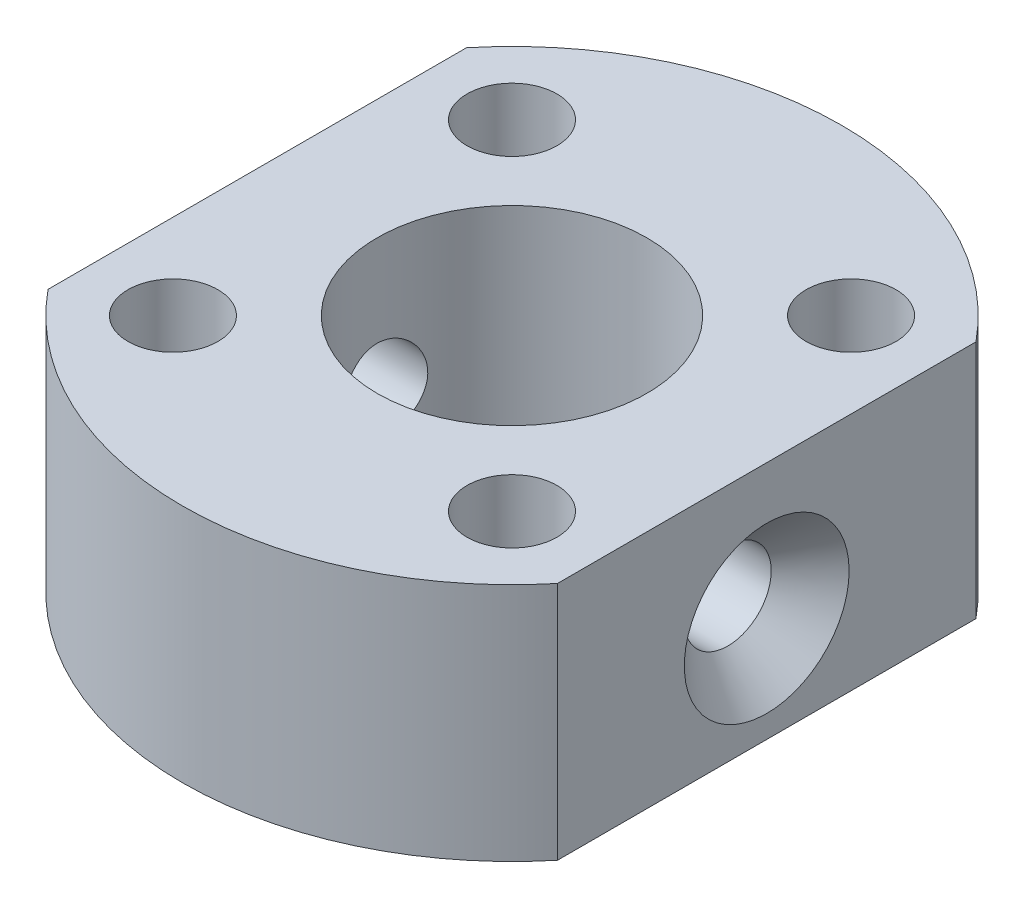
ISO-10303-21;
HEADER;
FILE_DESCRIPTION(('STEP AP214'),'2;1');
FILE_NAME('part.step','',(''),(''),'','','');
FILE_SCHEMA(('AUTOMOTIVE_DESIGN { 1 0 10303 214 1 1 1 1 }'));
ENDSEC;
DATA;
#1=APPLICATION_CONTEXT('core data for automotive mechanical design processes');
#2=APPLICATION_PROTOCOL_DEFINITION('international standard','automotive_design',2000,#1);
#3=PRODUCT_CONTEXT('',#1,'mechanical');
#4=PRODUCT('Part','Part','',(#3));
#5=PRODUCT_RELATED_PRODUCT_CATEGORY('part','',(#4));
#6=PRODUCT_DEFINITION_FORMATION('','',#4);
#7=PRODUCT_DEFINITION_CONTEXT('part definition',#1,'design');
#8=PRODUCT_DEFINITION('design','',#6,#7);
#9=PRODUCT_DEFINITION_SHAPE('','',#8);
#10=(LENGTH_UNIT() NAMED_UNIT(*) SI_UNIT(.MILLI.,.METRE.));
#11=(NAMED_UNIT(*) PLANE_ANGLE_UNIT() SI_UNIT($,.RADIAN.));
#12=(NAMED_UNIT(*) SI_UNIT($,.STERADIAN.) SOLID_ANGLE_UNIT());
#13=UNCERTAINTY_MEASURE_WITH_UNIT(LENGTH_MEASURE(1.E-05),#10,'distance_accuracy_value','');
#14=(GEOMETRIC_REPRESENTATION_CONTEXT(3) GLOBAL_UNCERTAINTY_ASSIGNED_CONTEXT((#13)) GLOBAL_UNIT_ASSIGNED_CONTEXT((#10,
#11,#12)) REPRESENTATION_CONTEXT('',''));
#15=CARTESIAN_POINT('',(0.,0.,0.));
#16=DIRECTION('',(0.,0.,1.));
#17=DIRECTION('',(1.,0.,0.));
#18=AXIS2_PLACEMENT_3D('',#15,#16,#17);
#19=CARTESIAN_POINT('',(0.,8.,0.));
#20=DIRECTION('',(0.,-1.,0.));
#21=DIRECTION('',(0.,0.,-1.));
#22=AXIS2_PLACEMENT_3D('',#19,#20,#21);
#23=CYLINDRICAL_SURFACE('',#22,11.);
#24=DIRECTION('',(0.,-1.,0.));
#25=VECTOR('',#24,1.);
#26=CARTESIAN_POINT('',(8.5,8.,6.98212002188447));
#27=LINE('',#26,#25);
#28=CARTESIAN_POINT('',(8.5,8.,6.98212002188447));
#29=VERTEX_POINT('',#28);
#30=CARTESIAN_POINT('',(8.5,0.,6.98212002188447));
#31=VERTEX_POINT('',#30);
#32=EDGE_CURVE('E62',#29,#31,#27,.T.);
#33=ORIENTED_EDGE('',*,*,#32,.F.);
#34=CARTESIAN_POINT('',(0.,8.,0.));
#35=DIRECTION('',(0.,1.,0.));
#36=DIRECTION('',(0.,0.,1.));
#37=AXIS2_PLACEMENT_3D('',#34,#35,#36);
#38=CIRCLE('',#37,11.);
#39=CARTESIAN_POINT('',(-8.5,8.,6.98212002188447));
#40=VERTEX_POINT('',#39);
#41=EDGE_CURVE('E203',#40,#29,#38,.T.);
#42=ORIENTED_EDGE('',*,*,#41,.F.);
#43=DIRECTION('',(0.,-1.,0.));
#44=VECTOR('',#43,1.);
#45=CARTESIAN_POINT('',(-8.5,8.,6.98212002188447));
#46=LINE('',#45,#44);
#47=CARTESIAN_POINT('',(-8.5,0.,6.98212002188447));
#48=VERTEX_POINT('',#47);
#49=EDGE_CURVE('E192',#48,#40,#46,.F.);
#50=ORIENTED_EDGE('',*,*,#49,.F.);
#51=CARTESIAN_POINT('',(0.,0.,0.));
#52=DIRECTION('',(0.,1.,0.));
#53=DIRECTION('',(0.,0.,1.));
#54=AXIS2_PLACEMENT_3D('',#51,#52,#53);
#55=CIRCLE('',#54,11.);
#56=EDGE_CURVE('E202',#48,#31,#55,.T.);
#57=ORIENTED_EDGE('',*,*,#56,.T.);
#58=EDGE_LOOP('',(#33,#42,#50,#57));
#59=FACE_BOUND('',#58,.T.);
#60=ADVANCED_FACE('F40',(#59),#23,.T.);
#61=DIRECTION('',(0.,-1.,0.));
#62=VECTOR('',#61,1.);
#63=CARTESIAN_POINT('',(8.5,8.,-6.98212002188447));
#64=LINE('',#63,#62);
#65=CARTESIAN_POINT('',(8.5,0.,-6.98212002188447));
#66=VERTEX_POINT('',#65);
#67=CARTESIAN_POINT('',(8.5,8.,-6.98212002188447));
#68=VERTEX_POINT('',#67);
#69=EDGE_CURVE('E197',#66,#68,#64,.F.);
#70=ORIENTED_EDGE('',*,*,#69,.F.);
#71=CARTESIAN_POINT('',(-8.5,0.,-6.98212002188447));
#72=VERTEX_POINT('',#71);
#73=EDGE_CURVE('E208',#66,#72,#55,.T.);
#74=ORIENTED_EDGE('',*,*,#73,.T.);
#75=DIRECTION('',(0.,-1.,0.));
#76=VECTOR('',#75,1.);
#77=CARTESIAN_POINT('',(-8.5,8.,-6.98212002188447));
#78=LINE('',#77,#76);
#79=CARTESIAN_POINT('',(-8.5,8.,-6.98212002188447));
#80=VERTEX_POINT('',#79);
#81=EDGE_CURVE('E55',#80,#72,#78,.T.);
#82=ORIENTED_EDGE('',*,*,#81,.F.);
#83=EDGE_CURVE('E207',#68,#80,#38,.T.);
#84=ORIENTED_EDGE('',*,*,#83,.F.);
#85=EDGE_LOOP('',(#70,#74,#82,#84));
#86=FACE_BOUND('',#85,.T.);
#87=ADVANCED_FACE('F221',(#86),#23,.T.);
#88=CARTESIAN_POINT('',(0.,8.,0.));
#89=DIRECTION('',(0.,1.,0.));
#90=DIRECTION('',(0.,0.,1.));
#91=AXIS2_PLACEMENT_3D('',#88,#89,#90);
#92=PLANE('',#91);
#93=CARTESIAN_POINT('',(5.65685424949235,8.,-5.65685424949241));
#94=DIRECTION('',(0.,1.,0.));
#95=DIRECTION('',(0.,0.,1.));
#96=AXIS2_PLACEMENT_3D('',#93,#94,#95);
#97=CIRCLE('',#96,1.49999999999999);
#98=CARTESIAN_POINT('',(5.65685424949235,8.,-4.15685424949242));
#99=VERTEX_POINT('',#98);
#100=EDGE_CURVE('E102',#99,#99,#97,.T.);
#101=ORIENTED_EDGE('',*,*,#100,.F.);
#102=EDGE_LOOP('',(#101));
#103=FACE_BOUND('',#102,.T.);
#104=CARTESIAN_POINT('',(5.65685424949235,8.,5.65685424949241));
#105=DIRECTION('',(0.,1.,0.));
#106=DIRECTION('',(0.,0.,1.));
#107=AXIS2_PLACEMENT_3D('',#104,#105,#106);
#108=CIRCLE('',#107,1.49999999999999);
#109=CARTESIAN_POINT('',(5.65685424949235,8.,7.1568542494924));
#110=VERTEX_POINT('',#109);
#111=EDGE_CURVE('E101',#110,#110,#108,.T.);
#112=ORIENTED_EDGE('',*,*,#111,.F.);
#113=EDGE_LOOP('',(#112));
#114=FACE_BOUND('',#113,.T.);
#115=CARTESIAN_POINT('',(-5.65685424949239,8.,5.65685424949237));
#116=DIRECTION('',(0.,1.,0.));
#117=DIRECTION('',(0.,0.,1.));
#118=AXIS2_PLACEMENT_3D('',#115,#116,#117);
#119=CIRCLE('',#118,1.49999999999999);
#120=CARTESIAN_POINT('',(-5.65685424949239,8.,7.15685424949236));
#121=VERTEX_POINT('',#120);
#122=EDGE_CURVE('E115',#121,#121,#119,.T.);
#123=ORIENTED_EDGE('',*,*,#122,.F.);
#124=EDGE_LOOP('',(#123));
#125=FACE_BOUND('',#124,.T.);
#126=CARTESIAN_POINT('',(-5.65685424949235,8.,-5.65685424949241));
#127=DIRECTION('',(0.,1.,0.));
#128=DIRECTION('',(0.,0.,1.));
#129=AXIS2_PLACEMENT_3D('',#126,#127,#128);
#130=CIRCLE('',#129,1.49999999999999);
#131=CARTESIAN_POINT('',(-5.65685424949235,8.,-4.15685424949242));
#132=VERTEX_POINT('',#131);
#133=EDGE_CURVE('E123',#132,#132,#130,.T.);
#134=ORIENTED_EDGE('',*,*,#133,.F.);
#135=EDGE_LOOP('',(#134));
#136=FACE_BOUND('',#135,.T.);
#137=CARTESIAN_POINT('',(0.,8.,0.));
#138=DIRECTION('',(0.,1.,0.));
#139=DIRECTION('',(0.,0.,1.));
#140=AXIS2_PLACEMENT_3D('',#137,#138,#139);
#141=CIRCLE('',#140,4.5);
#142=CARTESIAN_POINT('',(0.,8.,4.5));
#143=VERTEX_POINT('',#142);
#144=EDGE_CURVE('E175',#143,#143,#141,.T.);
#145=ORIENTED_EDGE('',*,*,#144,.F.);
#146=EDGE_LOOP('',(#145));
#147=FACE_BOUND('',#146,.T.);
#148=ORIENTED_EDGE('',*,*,#41,.T.);
#149=DIRECTION('',(0.,0.,-1.));
#150=VECTOR('',#149,1.);
#151=CARTESIAN_POINT('',(8.5,8.,-11.5));
#152=LINE('',#151,#150);
#153=EDGE_CURVE('E184',#29,#68,#152,.T.);
#154=ORIENTED_EDGE('',*,*,#153,.T.);
#155=ORIENTED_EDGE('',*,*,#83,.T.);
#156=DIRECTION('',(0.,0.,1.));
#157=VECTOR('',#156,1.);
#158=CARTESIAN_POINT('',(-8.5,8.,-11.5));
#159=LINE('',#158,#157);
#160=EDGE_CURVE('E188',#80,#40,#159,.T.);
#161=ORIENTED_EDGE('',*,*,#160,.T.);
#162=EDGE_LOOP('',(#148,#154,#155,#161));
#163=FACE_BOUND('',#162,.T.);
#164=ADVANCED_FACE('F217',(#103,#114,#125,#136,#147,#163),#92,.T.);
#165=CARTESIAN_POINT('',(0.,0.,0.));
#166=DIRECTION('',(0.,1.,0.));
#167=DIRECTION('',(0.,0.,1.));
#168=AXIS2_PLACEMENT_3D('',#165,#166,#167);
#169=PLANE('',#168);
#170=CARTESIAN_POINT('',(0.,0.,0.));
#171=DIRECTION('',(0.,1.,0.));
#172=DIRECTION('',(0.,0.,1.));
#173=AXIS2_PLACEMENT_3D('',#170,#171,#172);
#174=CIRCLE('',#173,4.5);
#175=CARTESIAN_POINT('',(0.,0.,4.5));
#176=VERTEX_POINT('',#175);
#177=EDGE_CURVE('E180',#176,#176,#174,.T.);
#178=ORIENTED_EDGE('',*,*,#177,.T.);
#179=EDGE_LOOP('',(#178));
#180=FACE_BOUND('',#179,.T.);
#181=DIRECTION('',(0.,0.,-1.));
#182=VECTOR('',#181,1.);
#183=CARTESIAN_POINT('',(8.5,0.,0.));
#184=LINE('',#183,#182);
#185=EDGE_CURVE('E12',#31,#66,#184,.T.);
#186=ORIENTED_EDGE('',*,*,#185,.F.);
#187=ORIENTED_EDGE('',*,*,#56,.F.);
#188=DIRECTION('',(0.,0.,1.));
#189=VECTOR('',#188,1.);
#190=CARTESIAN_POINT('',(-8.5,0.,0.));
#191=LINE('',#190,#189);
#192=EDGE_CURVE('E48',#72,#48,#191,.T.);
#193=ORIENTED_EDGE('',*,*,#192,.F.);
#194=ORIENTED_EDGE('',*,*,#73,.F.);
#195=EDGE_LOOP('',(#186,#187,#193,#194));
#196=FACE_BOUND('',#195,.T.);
#197=ADVANCED_FACE('F236',(#180,#196),#169,.F.);
#198=CARTESIAN_POINT('',(-8.5,0.,-11.5));
#199=DIRECTION('',(-1.,0.,0.));
#200=DIRECTION('',(0.,0.,1.));
#201=AXIS2_PLACEMENT_3D('',#198,#199,#200);
#202=PLANE('',#201);
#203=CARTESIAN_POINT('',(-8.5,3.5,0.));
#204=DIRECTION('',(-1.,0.,0.));
#205=DIRECTION('',(0.,0.,1.));
#206=AXIS2_PLACEMENT_3D('',#203,#204,#205);
#207=CIRCLE('',#206,2.75);
#208=CARTESIAN_POINT('',(-8.5,3.5,2.75));
#209=VERTEX_POINT('',#208);
#210=EDGE_CURVE('E148',#209,#209,#207,.T.);
#211=ORIENTED_EDGE('',*,*,#210,.F.);
#212=EDGE_LOOP('',(#211));
#213=FACE_BOUND('',#212,.T.);
#214=ORIENTED_EDGE('',*,*,#81,.T.);
#215=ORIENTED_EDGE('',*,*,#192,.T.);
#216=ORIENTED_EDGE('',*,*,#49,.T.);
#217=ORIENTED_EDGE('',*,*,#160,.F.);
#218=EDGE_LOOP('',(#214,#215,#216,#217));
#219=FACE_BOUND('',#218,.T.);
#220=ADVANCED_FACE('F233',(#213,#219),#202,.T.);
#221=CARTESIAN_POINT('',(8.5,0.,-11.5));
#222=DIRECTION('',(1.,0.,0.));
#223=DIRECTION('',(0.,0.,-1.));
#224=AXIS2_PLACEMENT_3D('',#221,#222,#223);
#225=PLANE('',#224);
#226=CARTESIAN_POINT('',(8.5,3.5,0.));
#227=DIRECTION('',(1.,0.,0.));
#228=DIRECTION('',(0.,0.,-1.));
#229=AXIS2_PLACEMENT_3D('',#226,#227,#228);
#230=CIRCLE('',#229,2.75);
#231=CARTESIAN_POINT('',(8.5,3.5,-2.75));
#232=VERTEX_POINT('',#231);
#233=EDGE_CURVE('E131',#232,#232,#230,.T.);
#234=ORIENTED_EDGE('',*,*,#233,.F.);
#235=EDGE_LOOP('',(#234));
#236=FACE_BOUND('',#235,.T.);
#237=ORIENTED_EDGE('',*,*,#32,.T.);
#238=ORIENTED_EDGE('',*,*,#185,.T.);
#239=ORIENTED_EDGE('',*,*,#69,.T.);
#240=ORIENTED_EDGE('',*,*,#153,.F.);
#241=EDGE_LOOP('',(#237,#238,#239,#240));
#242=FACE_BOUND('',#241,.T.);
#243=ADVANCED_FACE('F235',(#236,#242),#225,.T.);
#244=CARTESIAN_POINT('',(0.,8.,0.));
#245=DIRECTION('',(0.,1.,0.));
#246=DIRECTION('',(0.,0.,1.));
#247=AXIS2_PLACEMENT_3D('',#244,#245,#246);
#248=CYLINDRICAL_SURFACE('',#247,4.5);
#249=CARTESIAN_POINT('',(4.25998826289463,3.5,-1.45));
#250=CARTESIAN_POINT('',(4.25998843480729,3.42085654612259,-1.44999986275386));
#251=CARTESIAN_POINT('',(4.26221791336186,3.34171116376903,-1.44349836416739));
#252=CARTESIAN_POINT('',(4.27085237816489,3.18575460102328,-1.41774461709383));
#253=CARTESIAN_POINT('',(4.27725828599524,3.10894393973302,-1.39848955435671));
#254=CARTESIAN_POINT('',(4.29344634449653,2.95993960714215,-1.34796673756285));
#255=CARTESIAN_POINT('',(4.30322222469381,2.88773765410843,-1.31672128177157));
#256=CARTESIAN_POINT('',(4.32503983493147,2.74957890070288,-1.24317985490116));
#257=CARTESIAN_POINT('',(4.33708201208201,2.68362333652662,-1.20088170263162));
#258=CARTESIAN_POINT('',(4.36256885719382,2.55741968017783,-1.10478023899614));
#259=CARTESIAN_POINT('',(4.37604678447458,2.4974332735683,-1.0506420115697));
#260=CARTESIAN_POINT('',(4.40260437431034,2.38721423351113,-0.933112971044264));
#261=CARTESIAN_POINT('',(4.41568397727571,2.33698305346767,-0.869720781683794));
#262=CARTESIAN_POINT('',(4.44035377565032,2.24653065494341,-0.733587572821637));
#263=CARTESIAN_POINT('',(4.45190026881809,2.20658108694841,-0.660657440656988));
#264=CARTESIAN_POINT('',(4.47181288201274,2.1396185449379,-0.508677245618695));
#265=CARTESIAN_POINT('',(4.48017979952395,2.11260232660595,-0.42962872332232));
#266=CARTESIAN_POINT('',(4.49255504595337,2.07315338536801,-0.270397359870774));
#267=CARTESIAN_POINT('',(4.49669687773059,2.06027292699855,-0.19033601052849));
#268=CARTESIAN_POINT('',(4.50062788491011,2.04804021527624,-0.0290885061963798));
#269=CARTESIAN_POINT('',(4.50041811044096,2.04868469808834,0.0520973726964987));
#270=CARTESIAN_POINT('',(4.49576135753982,2.06319387515212,0.210129941132109));
#271=CARTESIAN_POINT('',(4.49147008506231,2.07657277534414,0.287026561670103));
#272=CARTESIAN_POINT('',(4.47932584070393,2.11537103916813,0.437418370233671));
#273=CARTESIAN_POINT('',(4.47147263196417,2.14079120351579,0.510913331700113));
#274=CARTESIAN_POINT('',(4.45288284428097,2.20324932346082,0.653509392045839));
#275=CARTESIAN_POINT('',(4.44211097932006,2.24043045460376,0.722542989094778));
#276=CARTESIAN_POINT('',(4.4188125675902,2.32523881560729,0.853538829809882));
#277=CARTESIAN_POINT('',(4.40628555650495,2.37286881156222,0.915499194385983));
#278=CARTESIAN_POINT('',(4.38015133485246,2.47969601152123,1.03348358868226));
#279=CARTESIAN_POINT('',(4.36652085189611,2.53931120304532,1.08912454273415));
#280=CARTESIAN_POINT('',(4.34018837664322,2.66714883685192,1.18973798311206));
#281=CARTESIAN_POINT('',(4.32748650875457,2.73537242908886,1.23470904178248));
#282=CARTESIAN_POINT('',(4.30432733766667,2.87963269293986,1.31319012451878));
#283=CARTESIAN_POINT('',(4.29390019875525,2.95575666004527,1.3465492569272));
#284=CARTESIAN_POINT('',(4.27682254694619,3.11296015529433,1.39985050179311));
#285=CARTESIAN_POINT('',(4.27017057467804,3.19403775506261,1.41979779943064));
#286=CARTESIAN_POINT('',(4.26172325303655,3.35515797587511,1.44495139403517));
#287=CARTESIAN_POINT('',(4.25973366261793,3.43509834212256,1.45074769679645));
#288=CARTESIAN_POINT('',(4.26029538586254,3.59481800879835,1.44909799094529));
#289=CARTESIAN_POINT('',(4.26284594260954,3.67459733385498,1.44165418967331));
#290=CARTESIAN_POINT('',(4.27200793264143,3.82912482939563,1.41426422391328));
#291=CARTESIAN_POINT('',(4.27848948362379,3.90395231810037,1.39471753055705));
#292=CARTESIAN_POINT('',(4.29464311616178,4.04925414879884,1.34415038015874));
#293=CARTESIAN_POINT('',(4.30431573932056,4.11972774941872,1.31312797529869));
#294=CARTESIAN_POINT('',(4.3261227195714,4.25667059385344,1.23942622885918));
#295=CARTESIAN_POINT('',(4.33832241713418,4.32295543141054,1.19642409002557));
#296=CARTESIAN_POINT('',(4.3636776129445,4.44758248891932,1.10035527996902));
#297=CARTESIAN_POINT('',(4.3768333743609,4.50592250916052,1.04728583106662));
#298=CARTESIAN_POINT('',(4.40332631251668,4.61568299270068,0.929783243165027));
#299=CARTESIAN_POINT('',(4.41664553300548,4.6666802829263,0.864949661569554));
#300=CARTESIAN_POINT('',(4.4413834308305,4.75709304045852,0.727320063390367));
#301=CARTESIAN_POINT('',(4.45280218731323,4.79650899013268,0.654524378604852));
#302=CARTESIAN_POINT('',(4.47239224002881,4.86226808970279,0.503450067464559));
#303=CARTESIAN_POINT('',(4.48058604310146,4.88870217290557,0.425214093473948));
#304=CARTESIAN_POINT('',(4.49290129083374,4.92794031909296,0.265093863734924));
#305=CARTESIAN_POINT('',(4.49702409897025,4.94074894569115,0.18321083908322));
#306=CARTESIAN_POINT('',(4.50063667693237,4.95198327309822,0.0220045960146037));
#307=CARTESIAN_POINT('',(4.50032277263335,4.95101843429272,-0.0572722334830517));
#308=CARTESIAN_POINT('',(4.49557348444239,4.93622063927699,-0.214482310536189));
#309=CARTESIAN_POINT('',(4.49113839872714,4.92238861403637,-0.292415654880322));
#310=CARTESIAN_POINT('',(4.47871185016364,4.88264501650148,-0.44364648156949));
#311=CARTESIAN_POINT('',(4.4707710966183,4.85690544083114,-0.516993624862787));
#312=CARTESIAN_POINT('',(4.45215120565194,4.7942343914887,-0.658360615574025));
#313=CARTESIAN_POINT('',(4.44147158547277,4.7573009445535,-0.726379521064036));
#314=CARTESIAN_POINT('',(4.41801190629691,4.67178315179805,-0.857778895505474));
#315=CARTESIAN_POINT('',(4.40517092418677,4.62283297798203,-0.920910270681518));
#316=CARTESIAN_POINT('',(4.37899878412106,4.5153058065229,-1.03826367259135));
#317=CARTESIAN_POINT('',(4.36566747601304,4.45672584057269,-1.09248294190092));
#318=CARTESIAN_POINT('',(4.33945291469102,4.32908640152932,-1.19244214632243));
#319=CARTESIAN_POINT('',(4.32660288000947,4.25972642772299,-1.23780821910568));
#320=CARTESIAN_POINT('',(4.30340590689848,4.11397356242311,-1.31619811224619));
#321=CARTESIAN_POINT('',(4.29305811689664,4.03758307583108,-1.34922613362166));
#322=CARTESIAN_POINT('',(4.27674101096689,3.88517636824037,-1.40005483746866));
#323=CARTESIAN_POINT('',(4.27052509513643,3.80947697875736,-1.41872638187046));
#324=CARTESIAN_POINT('',(4.26214922177381,3.6558519166389,-1.44369724527714));
#325=CARTESIAN_POINT('',(4.25998809362454,3.57792689314162,-1.45000013513644));
#326=CARTESIAN_POINT('',(4.25998826289463,3.5,-1.45));
#327=B_SPLINE_CURVE_WITH_KNOTS('',3,(#249,#250,#251,#252,#253,#254,#255,#256,#257,#258,#259,
#260,#261,#262,#263,#264,#265,#266,#267,#268,#269,#270,#271,#272,#273,#274,#275,#276,#277,#278,
#279,#280,#281,#282,#283,#284,#285,#286,#287,#288,#289,#290,#291,#292,#293,#294,#295,#296,#297,
#298,#299,#300,#301,#302,#303,#304,#305,#306,#307,#308,#309,#310,#311,#312,#313,#314,#315,#316,
#317,#318,#319,#320,#321,#322,#323,#324,#325,#326),.UNSPECIFIED.,.T.,.F.,(4,2,2,2,2,2,2,2,2,2,2,
2,2,2,2,2,2,2,2,2,2,2,2,2,2,2,2,2,2,2,2,2,2,2,2,2,2,2,4),(0.,0.237142175863097,0.47433669786316,
0.711092235574051,0.947894531053719,1.19254688870069,1.43723566850858,1.6878457599907,
1.9383929532251,2.18075227046639,2.42305310229726,2.65646616424945,2.88989474979952,
3.12628212635392,3.36273215665536,3.60962584854146,3.85655255674329,4.10657765809914,
4.35650604101312,4.59582122111622,4.83509650723012,5.0668667105068,5.29867627112219,
5.53746401151743,5.77631773210512,6.02579501876531,6.27526191312118,6.5229555313129,
6.77056616261904,7.00725560123781,7.24392791617995,7.47728355561253,7.71068035508264,
7.9523308708367,8.19405601360001,8.44445080172215,8.69476025433229,8.92832461827025,
9.1618215417995),.UNSPECIFIED.);
#328=CARTESIAN_POINT('',(4.25998826289463,3.5,-1.45));
#329=VERTEX_POINT('',#328);
#330=EDGE_CURVE('E136',#329,#329,#327,.T.);
#331=ORIENTED_EDGE('',*,*,#330,.F.);
#332=EDGE_LOOP('',(#331));
#333=FACE_BOUND('',#332,.T.);
#334=CARTESIAN_POINT('',(-4.25998826289463,3.5,1.45));
#335=CARTESIAN_POINT('',(-4.25998843480729,3.57914345387741,1.44999986275386));
#336=CARTESIAN_POINT('',(-4.26221791336186,3.65828883623098,1.44349836416739));
#337=CARTESIAN_POINT('',(-4.27085237816489,3.81424539897672,1.41774461709383));
#338=CARTESIAN_POINT('',(-4.27725828599524,3.89105606026698,1.39848955435671));
#339=CARTESIAN_POINT('',(-4.29344634449653,4.04006039285785,1.34796673756285));
#340=CARTESIAN_POINT('',(-4.30322222469381,4.11226234589157,1.31672128177157));
#341=CARTESIAN_POINT('',(-4.32503983493147,4.25042109929712,1.24317985490116));
#342=CARTESIAN_POINT('',(-4.33708201208201,4.31637666347339,1.20088170263162));
#343=CARTESIAN_POINT('',(-4.36256885719382,4.44258031982218,1.10478023899614));
#344=CARTESIAN_POINT('',(-4.37604678447458,4.5025667264317,1.0506420115697));
#345=CARTESIAN_POINT('',(-4.40260437431034,4.61278576648887,0.933112971044264));
#346=CARTESIAN_POINT('',(-4.41568397727571,4.66301694653233,0.869720781683794));
#347=CARTESIAN_POINT('',(-4.44035377565032,4.75346934505659,0.733587572821637));
#348=CARTESIAN_POINT('',(-4.45190026881809,4.79341891305159,0.660657440656989));
#349=CARTESIAN_POINT('',(-4.47181288201274,4.8603814550621,0.508677245618696));
#350=CARTESIAN_POINT('',(-4.48017979952395,4.88739767339405,0.429628723322321));
#351=CARTESIAN_POINT('',(-4.49255504595337,4.926846614632,0.270397359870775));
#352=CARTESIAN_POINT('',(-4.49669687773059,4.93972707300145,0.19033601052849));
#353=CARTESIAN_POINT('',(-4.50062788491011,4.95195978472376,0.0290885061963804));
#354=CARTESIAN_POINT('',(-4.50041811044096,4.95131530191167,-0.0520973726964982));
#355=CARTESIAN_POINT('',(-4.49576135753982,4.93680612484789,-0.210129941132109));
#356=CARTESIAN_POINT('',(-4.49147008506231,4.92342722465586,-0.287026561670103));
#357=CARTESIAN_POINT('',(-4.47932584070393,4.88462896083187,-0.437418370233671));
#358=CARTESIAN_POINT('',(-4.47147263196417,4.85920879648421,-0.510913331700112));
#359=CARTESIAN_POINT('',(-4.45288284428097,4.79675067653918,-0.653509392045839));
#360=CARTESIAN_POINT('',(-4.44211097932006,4.75956954539624,-0.722542989094778));
#361=CARTESIAN_POINT('',(-4.4188125675902,4.67476118439272,-0.853538829809882));
#362=CARTESIAN_POINT('',(-4.40628555650495,4.62713118843778,-0.915499194385983));
#363=CARTESIAN_POINT('',(-4.38015133485246,4.52030398847877,-1.03348358868226));
#364=CARTESIAN_POINT('',(-4.3665208518961,4.46068879695468,-1.08912454273415));
#365=CARTESIAN_POINT('',(-4.34018837664322,4.33285116314809,-1.18973798311206));
#366=CARTESIAN_POINT('',(-4.32748650875457,4.26462757091114,-1.23470904178248));
#367=CARTESIAN_POINT('',(-4.30432733766667,4.12036730706015,-1.31319012451878));
#368=CARTESIAN_POINT('',(-4.29390019875525,4.04424333995474,-1.3465492569272));
#369=CARTESIAN_POINT('',(-4.27682254694619,3.88703984470567,-1.39985050179311));
#370=CARTESIAN_POINT('',(-4.27017057467804,3.80596224493739,-1.41979779943064));
#371=CARTESIAN_POINT('',(-4.26172325303655,3.64484202412489,-1.44495139403517));
#372=CARTESIAN_POINT('',(-4.25973366261793,3.56490165787744,-1.45074769679645));
#373=CARTESIAN_POINT('',(-4.26029538586254,3.40518199120166,-1.44909799094529));
#374=CARTESIAN_POINT('',(-4.26284594260954,3.32540266614502,-1.44165418967331));
#375=CARTESIAN_POINT('',(-4.27200793264143,3.17087517060438,-1.41426422391328));
#376=CARTESIAN_POINT('',(-4.27848948362379,3.09604768189963,-1.39471753055705));
#377=CARTESIAN_POINT('',(-4.29464311616178,2.95074585120116,-1.34415038015874));
#378=CARTESIAN_POINT('',(-4.30431573932056,2.88027225058128,-1.31312797529869));
#379=CARTESIAN_POINT('',(-4.3261227195714,2.74332940614656,-1.23942622885918));
#380=CARTESIAN_POINT('',(-4.33832241713418,2.67704456858946,-1.19642409002557));
#381=CARTESIAN_POINT('',(-4.3636776129445,2.55241751108068,-1.10035527996903));
#382=CARTESIAN_POINT('',(-4.3768333743609,2.49407749083948,-1.04728583106662));
#383=CARTESIAN_POINT('',(-4.40332631251668,2.38431700729932,-0.929783243165027));
#384=CARTESIAN_POINT('',(-4.41664553300548,2.3333197170737,-0.864949661569554));
#385=CARTESIAN_POINT('',(-4.4413834308305,2.24290695954149,-0.727320063390367));
#386=CARTESIAN_POINT('',(-4.45280218731323,2.20349100986732,-0.654524378604852));
#387=CARTESIAN_POINT('',(-4.47239224002881,2.13773191029721,-0.50345006746456));
#388=CARTESIAN_POINT('',(-4.48058604310146,2.11129782709443,-0.425214093473949));
#389=CARTESIAN_POINT('',(-4.49290129083374,2.07205968090704,-0.265093863734925));
#390=CARTESIAN_POINT('',(-4.49702409897025,2.05925105430885,-0.183210839083221));
#391=CARTESIAN_POINT('',(-4.50063667693237,2.04801672690179,-0.0220045960146047));
#392=CARTESIAN_POINT('',(-4.50032277263335,2.04898156570728,0.0572722334830507));
#393=CARTESIAN_POINT('',(-4.49557348444239,2.06377936072301,0.214482310536188));
#394=CARTESIAN_POINT('',(-4.49113839872714,2.07761138596364,0.292415654880322));
#395=CARTESIAN_POINT('',(-4.47871185016364,2.11735498349852,0.443646481569489));
#396=CARTESIAN_POINT('',(-4.4707710966183,2.14309455916886,0.516993624862787));
#397=CARTESIAN_POINT('',(-4.45215120565194,2.2057656085113,0.658360615574024));
#398=CARTESIAN_POINT('',(-4.44147158547277,2.2426990554465,0.726379521064036));
#399=CARTESIAN_POINT('',(-4.41801190629691,2.32821684820195,0.857778895505474));
#400=CARTESIAN_POINT('',(-4.40517092418677,2.37716702201798,0.920910270681518));
#401=CARTESIAN_POINT('',(-4.37899878412106,2.4846941934771,1.03826367259135));
#402=CARTESIAN_POINT('',(-4.36566747601304,2.54327415942731,1.09248294190092));
#403=CARTESIAN_POINT('',(-4.33945291469103,2.67091359847068,1.19244214632243));
#404=CARTESIAN_POINT('',(-4.32660288000947,2.74027357227701,1.23780821910568));
#405=CARTESIAN_POINT('',(-4.30340590689848,2.88602643757689,1.31619811224619));
#406=CARTESIAN_POINT('',(-4.29305811689664,2.96241692416892,1.34922613362166));
#407=CARTESIAN_POINT('',(-4.27674101096689,3.11482363175963,1.40005483746866));
#408=CARTESIAN_POINT('',(-4.27052509513643,3.19052302124264,1.41872638187046));
#409=CARTESIAN_POINT('',(-4.26214922177381,3.3441480833611,1.44369724527714));
#410=CARTESIAN_POINT('',(-4.25998809362454,3.42207310685838,1.45000013513644));
#411=CARTESIAN_POINT('',(-4.25998826289463,3.5,1.45));
#412=B_SPLINE_CURVE_WITH_KNOTS('',3,(#334,#335,#336,#337,#338,#339,#340,#341,#342,#343,#344,
#345,#346,#347,#348,#349,#350,#351,#352,#353,#354,#355,#356,#357,#358,#359,#360,#361,#362,#363,
#364,#365,#366,#367,#368,#369,#370,#371,#372,#373,#374,#375,#376,#377,#378,#379,#380,#381,#382,
#383,#384,#385,#386,#387,#388,#389,#390,#391,#392,#393,#394,#395,#396,#397,#398,#399,#400,#401,
#402,#403,#404,#405,#406,#407,#408,#409,#410,#411),.UNSPECIFIED.,.T.,.F.,(4,2,2,2,2,2,2,2,2,2,2,
2,2,2,2,2,2,2,2,2,2,2,2,2,2,2,2,2,2,2,2,2,2,2,2,2,2,2,4),(0.,0.237142175863098,0.47433669786316,
0.711092235574051,0.94789453105372,1.19254688870069,1.43723566850858,1.6878457599907,
1.9383929532251,2.18075227046639,2.42305310229726,2.65646616424945,2.88989474979952,
3.12628212635392,3.36273215665536,3.60962584854146,3.85655255674329,4.10657765809914,
4.35650604101312,4.59582122111622,4.83509650723012,5.06686671050681,5.29867627112219,
5.53746401151743,5.77631773210512,6.02579501876531,6.27526191312118,6.5229555313129,
6.77056616261904,7.00725560123781,7.24392791617995,7.47728355561253,7.71068035508264,
7.95233087083671,8.19405601360001,8.44445080172216,8.69476025433229,8.92832461827025,
9.1618215417995),.UNSPECIFIED.);
#413=CARTESIAN_POINT('',(-4.25998826289463,3.5,1.45));
#414=VERTEX_POINT('',#413);
#415=EDGE_CURVE('E168',#414,#414,#412,.T.);
#416=ORIENTED_EDGE('',*,*,#415,.T.);
#417=EDGE_LOOP('',(#416));
#418=FACE_BOUND('',#417,.T.);
#419=ORIENTED_EDGE('',*,*,#177,.F.);
#420=EDGE_LOOP('',(#419));
#421=FACE_BOUND('',#420,.T.);
#422=ORIENTED_EDGE('',*,*,#144,.T.);
#423=EDGE_LOOP('',(#422));
#424=FACE_BOUND('',#423,.T.);
#425=ADVANCED_FACE('F163',(#333,#418,#421,#424),#248,.F.);
#426=CARTESIAN_POINT('',(-8.5,3.5,0.));
#427=DIRECTION('',(-1.,0.,0.));
#428=DIRECTION('',(0.,0.,1.));
#429=AXIS2_PLACEMENT_3D('',#426,#427,#428);
#430=CYLINDRICAL_SURFACE('',#429,1.45);
#431=ORIENTED_EDGE('',*,*,#415,.F.);
#432=EDGE_LOOP('',(#431));
#433=FACE_BOUND('',#432,.T.);
#434=CARTESIAN_POINT('',(-7.2,3.5,0.));
#435=DIRECTION('',(-1.,0.,0.));
#436=DIRECTION('',(0.,0.,1.));
#437=AXIS2_PLACEMENT_3D('',#434,#435,#436);
#438=CIRCLE('',#437,1.45);
#439=CARTESIAN_POINT('',(-7.2,3.5,1.45));
#440=VERTEX_POINT('',#439);
#441=EDGE_CURVE('E176',#440,#440,#438,.T.);
#442=ORIENTED_EDGE('',*,*,#441,.T.);
#443=EDGE_LOOP('',(#442));
#444=FACE_BOUND('',#443,.T.);
#445=ADVANCED_FACE('F158',(#433,#444),#430,.F.);
#446=CARTESIAN_POINT('',(-8.5,3.5,0.));
#447=DIRECTION('',(-1.,0.,0.));
#448=DIRECTION('',(0.,0.,1.));
#449=AXIS2_PLACEMENT_3D('',#446,#447,#448);
#450=CONICAL_SURFACE('',#449,2.75,0.785398163397449);
#451=ORIENTED_EDGE('',*,*,#441,.F.);
#452=EDGE_LOOP('',(#451));
#453=FACE_BOUND('',#452,.T.);
#454=ORIENTED_EDGE('',*,*,#210,.T.);
#455=EDGE_LOOP('',(#454));
#456=FACE_BOUND('',#455,.T.);
#457=ADVANCED_FACE('F155',(#453,#456),#450,.F.);
#458=CARTESIAN_POINT('',(8.5,3.5,0.));
#459=DIRECTION('',(1.,0.,0.));
#460=DIRECTION('',(0.,0.,-1.));
#461=AXIS2_PLACEMENT_3D('',#458,#459,#460);
#462=CYLINDRICAL_SURFACE('',#461,1.45);
#463=ORIENTED_EDGE('',*,*,#330,.T.);
#464=EDGE_LOOP('',(#463));
#465=FACE_BOUND('',#464,.T.);
#466=CARTESIAN_POINT('',(7.2,3.5,0.));
#467=DIRECTION('',(1.,0.,0.));
#468=DIRECTION('',(0.,0.,-1.));
#469=AXIS2_PLACEMENT_3D('',#466,#467,#468);
#470=CIRCLE('',#469,1.45);
#471=CARTESIAN_POINT('',(7.2,3.5,-1.45));
#472=VERTEX_POINT('',#471);
#473=EDGE_CURVE('E132',#472,#472,#470,.T.);
#474=ORIENTED_EDGE('',*,*,#473,.T.);
#475=EDGE_LOOP('',(#474));
#476=FACE_BOUND('',#475,.T.);
#477=ADVANCED_FACE('F150',(#465,#476),#462,.F.);
#478=CARTESIAN_POINT('',(8.5,3.5,0.));
#479=DIRECTION('',(1.,0.,0.));
#480=DIRECTION('',(0.,0.,-1.));
#481=AXIS2_PLACEMENT_3D('',#478,#479,#480);
#482=CONICAL_SURFACE('',#481,2.75,0.785398163397449);
#483=ORIENTED_EDGE('',*,*,#473,.F.);
#484=EDGE_LOOP('',(#483));
#485=FACE_BOUND('',#484,.T.);
#486=ORIENTED_EDGE('',*,*,#233,.T.);
#487=EDGE_LOOP('',(#486));
#488=FACE_BOUND('',#487,.T.);
#489=ADVANCED_FACE('F282',(#485,#488),#482,.F.);
#490=CARTESIAN_POINT('',(-5.65685424949235,2.,-5.65685424949241));
#491=DIRECTION('',(0.,1.,0.));
#492=DIRECTION('',(0.,0.,1.));
#493=AXIS2_PLACEMENT_3D('',#490,#491,#492);
#494=CONICAL_SURFACE('',#493,1.5,1.02974425867665);
#495=CARTESIAN_POINT('',(-5.65685424949235,1.09870907145866,-5.65685424949241));
#496=VERTEX_POINT('',#495);
#497=VERTEX_LOOP('',#496);
#498=FACE_BOUND('',#497,.T.);
#499=CARTESIAN_POINT('',(-5.65685424949235,2.,-5.65685424949241));
#500=DIRECTION('',(0.,1.,0.));
#501=DIRECTION('',(0.,0.,1.));
#502=AXIS2_PLACEMENT_3D('',#499,#500,#501);
#503=CIRCLE('',#502,1.5);
#504=CARTESIAN_POINT('',(-5.65685424949235,2.,-4.15685424949241));
#505=VERTEX_POINT('',#504);
#506=EDGE_CURVE('E127',#505,#505,#503,.T.);
#507=ORIENTED_EDGE('',*,*,#506,.T.);
#508=EDGE_LOOP('',(#507));
#509=FACE_BOUND('',#508,.T.);
#510=ADVANCED_FACE('F287',(#498,#509),#494,.F.);
#511=CARTESIAN_POINT('',(-5.65685424949235,8.,-5.65685424949241));
#512=DIRECTION('',(0.,1.,0.));
#513=DIRECTION('',(0.,0.,1.));
#514=AXIS2_PLACEMENT_3D('',#511,#512,#513);
#515=CYLINDRICAL_SURFACE('',#514,1.49999999999999);
#516=ORIENTED_EDGE('',*,*,#506,.F.);
#517=EDGE_LOOP('',(#516));
#518=FACE_BOUND('',#517,.T.);
#519=ORIENTED_EDGE('',*,*,#133,.T.);
#520=EDGE_LOOP('',(#519));
#521=FACE_BOUND('',#520,.T.);
#522=ADVANCED_FACE('F292',(#518,#521),#515,.F.);
#523=CARTESIAN_POINT('',(-5.65685424949239,2.,5.65685424949237));
#524=DIRECTION('',(0.,1.,0.));
#525=DIRECTION('',(0.,0.,1.));
#526=AXIS2_PLACEMENT_3D('',#523,#524,#525);
#527=CONICAL_SURFACE('',#526,1.5,1.02974425867665);
#528=CARTESIAN_POINT('',(-5.65685424949239,1.09870907145866,5.65685424949237));
#529=VERTEX_POINT('',#528);
#530=VERTEX_LOOP('',#529);
#531=FACE_BOUND('',#530,.T.);
#532=CARTESIAN_POINT('',(-5.65685424949239,2.,5.65685424949237));
#533=DIRECTION('',(0.,1.,0.));
#534=DIRECTION('',(0.,0.,1.));
#535=AXIS2_PLACEMENT_3D('',#532,#533,#534);
#536=CIRCLE('',#535,1.5);
#537=CARTESIAN_POINT('',(-5.65685424949239,2.,7.15685424949237));
#538=VERTEX_POINT('',#537);
#539=EDGE_CURVE('E119',#538,#538,#536,.T.);
#540=ORIENTED_EDGE('',*,*,#539,.T.);
#541=EDGE_LOOP('',(#540));
#542=FACE_BOUND('',#541,.T.);
#543=ADVANCED_FACE('F298',(#531,#542),#527,.F.);
#544=CARTESIAN_POINT('',(-5.65685424949239,8.,5.65685424949237));
#545=DIRECTION('',(0.,1.,0.));
#546=DIRECTION('',(0.,0.,1.));
#547=AXIS2_PLACEMENT_3D('',#544,#545,#546);
#548=CYLINDRICAL_SURFACE('',#547,1.49999999999999);
#549=ORIENTED_EDGE('',*,*,#539,.F.);
#550=EDGE_LOOP('',(#549));
#551=FACE_BOUND('',#550,.T.);
#552=ORIENTED_EDGE('',*,*,#122,.T.);
#553=EDGE_LOOP('',(#552));
#554=FACE_BOUND('',#553,.T.);
#555=ADVANCED_FACE('F302',(#551,#554),#548,.F.);
#556=CARTESIAN_POINT('',(5.65685424949235,2.,5.65685424949241));
#557=DIRECTION('',(0.,1.,0.));
#558=DIRECTION('',(0.,0.,1.));
#559=AXIS2_PLACEMENT_3D('',#556,#557,#558);
#560=CONICAL_SURFACE('',#559,1.5,1.02974425867665);
#561=CARTESIAN_POINT('',(5.65685424949235,1.09870907145866,5.65685424949241));
#562=VERTEX_POINT('',#561);
#563=VERTEX_LOOP('',#562);
#564=FACE_BOUND('',#563,.T.);
#565=CARTESIAN_POINT('',(5.65685424949235,2.,5.65685424949241));
#566=DIRECTION('',(0.,1.,0.));
#567=DIRECTION('',(0.,0.,1.));
#568=AXIS2_PLACEMENT_3D('',#565,#566,#567);
#569=CIRCLE('',#568,1.5);
#570=CARTESIAN_POINT('',(5.65685424949235,2.,7.15685424949241));
#571=VERTEX_POINT('',#570);
#572=EDGE_CURVE('E107',#571,#571,#569,.T.);
#573=ORIENTED_EDGE('',*,*,#572,.T.);
#574=EDGE_LOOP('',(#573));
#575=FACE_BOUND('',#574,.T.);
#576=ADVANCED_FACE('F306',(#564,#575),#560,.F.);
#577=CARTESIAN_POINT('',(5.65685424949235,8.,5.65685424949241));
#578=DIRECTION('',(0.,1.,0.));
#579=DIRECTION('',(0.,0.,1.));
#580=AXIS2_PLACEMENT_3D('',#577,#578,#579);
#581=CYLINDRICAL_SURFACE('',#580,1.49999999999999);
#582=ORIENTED_EDGE('',*,*,#572,.F.);
#583=EDGE_LOOP('',(#582));
#584=FACE_BOUND('',#583,.T.);
#585=ORIENTED_EDGE('',*,*,#111,.T.);
#586=EDGE_LOOP('',(#585));
#587=FACE_BOUND('',#586,.T.);
#588=ADVANCED_FACE('F94',(#584,#587),#581,.F.);
#589=CARTESIAN_POINT('',(5.65685424949235,2.,-5.65685424949241));
#590=DIRECTION('',(0.,1.,0.));
#591=DIRECTION('',(0.,0.,1.));
#592=AXIS2_PLACEMENT_3D('',#589,#590,#591);
#593=CONICAL_SURFACE('',#592,1.5,1.02974425867665);
#594=CARTESIAN_POINT('',(5.65685424949235,1.09870907145866,-5.65685424949241));
#595=VERTEX_POINT('',#594);
#596=VERTEX_LOOP('',#595);
#597=FACE_BOUND('',#596,.T.);
#598=CARTESIAN_POINT('',(5.65685424949235,2.,-5.65685424949241));
#599=DIRECTION('',(0.,1.,0.));
#600=DIRECTION('',(0.,0.,1.));
#601=AXIS2_PLACEMENT_3D('',#598,#599,#600);
#602=CIRCLE('',#601,1.5);
#603=CARTESIAN_POINT('',(5.65685424949235,2.,-4.15685424949241));
#604=VERTEX_POINT('',#603);
#605=EDGE_CURVE('E98',#604,#604,#602,.T.);
#606=ORIENTED_EDGE('',*,*,#605,.T.);
#607=EDGE_LOOP('',(#606));
#608=FACE_BOUND('',#607,.T.);
#609=ADVANCED_FACE('F90',(#597,#608),#593,.F.);
#610=CARTESIAN_POINT('',(5.65685424949235,8.,-5.65685424949241));
#611=DIRECTION('',(0.,1.,0.));
#612=DIRECTION('',(0.,0.,1.));
#613=AXIS2_PLACEMENT_3D('',#610,#611,#612);
#614=CYLINDRICAL_SURFACE('',#613,1.49999999999999);
#615=ORIENTED_EDGE('',*,*,#605,.F.);
#616=EDGE_LOOP('',(#615));
#617=FACE_BOUND('',#616,.T.);
#618=ORIENTED_EDGE('',*,*,#100,.T.);
#619=EDGE_LOOP('',(#618));
#620=FACE_BOUND('',#619,.T.);
#621=ADVANCED_FACE('F93',(#617,#620),#614,.F.);
#622=CLOSED_SHELL('',(#60,#87,#164,#197,#220,#243,#425,#445,#457,#477,#489,#510,#522,#543,#555,
#576,#588,#609,#621));
#623=MANIFOLD_SOLID_BREP('B2',#622);
#624=ADVANCED_BREP_SHAPE_REPRESENTATION('',(#18,#623),#14);
#625=SHAPE_DEFINITION_REPRESENTATION(#9,#624);
ENDSEC;
END-ISO-10303-21;
